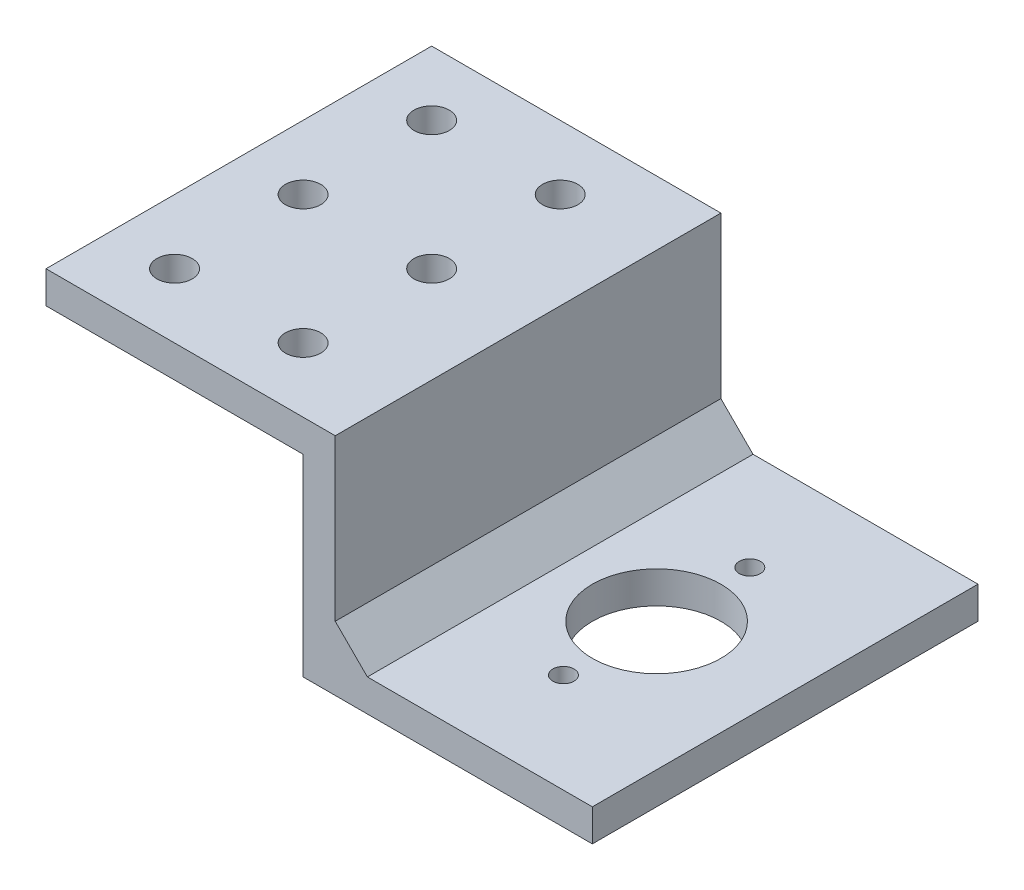
ISO-10303-21;
HEADER;
FILE_DESCRIPTION(('STEP AP214'),'2;1');
FILE_NAME('part.step','',(''),(''),'','','');
FILE_SCHEMA(('AUTOMOTIVE_DESIGN { 1 0 10303 214 1 1 1 1 }'));
ENDSEC;
DATA;
#1=APPLICATION_CONTEXT('core data for automotive mechanical design processes');
#2=APPLICATION_PROTOCOL_DEFINITION('international standard','automotive_design',2000,#1);
#3=PRODUCT_CONTEXT('',#1,'mechanical');
#4=PRODUCT('Part','Part','',(#3));
#5=PRODUCT_RELATED_PRODUCT_CATEGORY('part','',(#4));
#6=PRODUCT_DEFINITION_FORMATION('','',#4);
#7=PRODUCT_DEFINITION_CONTEXT('part definition',#1,'design');
#8=PRODUCT_DEFINITION('design','',#6,#7);
#9=PRODUCT_DEFINITION_SHAPE('','',#8);
#10=(LENGTH_UNIT() NAMED_UNIT(*) SI_UNIT(.MILLI.,.METRE.));
#11=(NAMED_UNIT(*) PLANE_ANGLE_UNIT() SI_UNIT($,.RADIAN.));
#12=(NAMED_UNIT(*) SI_UNIT($,.STERADIAN.) SOLID_ANGLE_UNIT());
#13=UNCERTAINTY_MEASURE_WITH_UNIT(LENGTH_MEASURE(1.E-05),#10,'distance_accuracy_value','');
#14=(GEOMETRIC_REPRESENTATION_CONTEXT(3) GLOBAL_UNCERTAINTY_ASSIGNED_CONTEXT((#13)) GLOBAL_UNIT_ASSIGNED_CONTEXT((#10,
#11,#12)) REPRESENTATION_CONTEXT('',''));
#15=CARTESIAN_POINT('',(0.,0.,0.));
#16=DIRECTION('',(0.,0.,1.));
#17=DIRECTION('',(1.,0.,0.));
#18=AXIS2_PLACEMENT_3D('',#15,#16,#17);
#19=CARTESIAN_POINT('',(0.,5.,60.));
#20=DIRECTION('',(-1.,0.,0.));
#21=DIRECTION('',(0.,-1.,0.));
#22=AXIS2_PLACEMENT_3D('',#19,#20,#21);
#23=PLANE('',#22);
#24=DIRECTION('',(0.,1.,0.));
#25=VECTOR('',#24,1.);
#26=CARTESIAN_POINT('',(0.,5.,0.));
#27=LINE('',#26,#25);
#28=CARTESIAN_POINT('',(0.,0.,0.));
#29=VERTEX_POINT('',#28);
#30=CARTESIAN_POINT('',(0.,5.,0.));
#31=VERTEX_POINT('',#30);
#32=EDGE_CURVE('E132',#29,#31,#27,.T.);
#33=ORIENTED_EDGE('',*,*,#32,.T.);
#34=DIRECTION('',(0.,0.,-1.));
#35=VECTOR('',#34,1.);
#36=CARTESIAN_POINT('',(0.,5.,60.));
#37=LINE('',#36,#35);
#38=CARTESIAN_POINT('',(0.,5.,60.));
#39=VERTEX_POINT('',#38);
#40=EDGE_CURVE('E113',#39,#31,#37,.T.);
#41=ORIENTED_EDGE('',*,*,#40,.F.);
#42=DIRECTION('',(0.,1.,0.));
#43=VECTOR('',#42,1.);
#44=CARTESIAN_POINT('',(0.,5.,60.));
#45=LINE('',#44,#43);
#46=CARTESIAN_POINT('',(0.,0.,60.));
#47=VERTEX_POINT('',#46);
#48=EDGE_CURVE('E119',#47,#39,#45,.T.);
#49=ORIENTED_EDGE('',*,*,#48,.F.);
#50=DIRECTION('',(0.,0.,-1.));
#51=VECTOR('',#50,1.);
#52=CARTESIAN_POINT('',(0.,0.,60.));
#53=LINE('',#52,#51);
#54=EDGE_CURVE('E163',#47,#29,#53,.T.);
#55=ORIENTED_EDGE('',*,*,#54,.T.);
#56=EDGE_LOOP('',(#33,#41,#49,#55));
#57=FACE_BOUND('',#56,.T.);
#58=ADVANCED_FACE('F40',(#57),#23,.F.);
#59=CARTESIAN_POINT('',(-40.,5.00000000000001,60.));
#60=DIRECTION('',(0.,-1.,0.));
#61=DIRECTION('',(1.,0.,0.));
#62=AXIS2_PLACEMENT_3D('',#59,#60,#61);
#63=PLANE('',#62);
#64=CARTESIAN_POINT('',(-20.,5.,44.5));
#65=DIRECTION('',(0.,1.,0.));
#66=DIRECTION('',(1.,0.,0.));
#67=AXIS2_PLACEMENT_3D('',#64,#65,#66);
#68=CIRCLE('',#67,1.65);
#69=CARTESIAN_POINT('',(-21.65,5.,44.5));
#70=VERTEX_POINT('',#69);
#71=EDGE_CURVE('E261',#70,#70,#68,.T.);
#72=ORIENTED_EDGE('',*,*,#71,.F.);
#73=EDGE_LOOP('',(#72));
#74=FACE_BOUND('',#73,.T.);
#75=CARTESIAN_POINT('',(-20.,5.,15.5));
#76=DIRECTION('',(0.,1.,0.));
#77=DIRECTION('',(-1.,0.,0.));
#78=AXIS2_PLACEMENT_3D('',#75,#76,#77);
#79=CIRCLE('',#78,1.65);
#80=CARTESIAN_POINT('',(-21.65,5.,15.5));
#81=VERTEX_POINT('',#80);
#82=EDGE_CURVE('E269',#81,#81,#79,.T.);
#83=ORIENTED_EDGE('',*,*,#82,.F.);
#84=EDGE_LOOP('',(#83));
#85=FACE_BOUND('',#84,.T.);
#86=CARTESIAN_POINT('',(-20.,5.,30.));
#87=DIRECTION('',(0.,1.,0.));
#88=DIRECTION('',(-1.,0.,0.));
#89=AXIS2_PLACEMENT_3D('',#86,#87,#88);
#90=CIRCLE('',#89,10.);
#91=CARTESIAN_POINT('',(-30.,5.,30.));
#92=VERTEX_POINT('',#91);
#93=EDGE_CURVE('E253',#92,#92,#90,.T.);
#94=ORIENTED_EDGE('',*,*,#93,.F.);
#95=EDGE_LOOP('',(#94));
#96=FACE_BOUND('',#95,.T.);
#97=DIRECTION('',(-1.,0.,0.));
#98=VECTOR('',#97,1.);
#99=CARTESIAN_POINT('',(-40.,5.00000000000001,0.));
#100=LINE('',#99,#98);
#101=CARTESIAN_POINT('',(-35.,5.00000000000001,0.));
#102=VERTEX_POINT('',#101);
#103=EDGE_CURVE('E183',#31,#102,#100,.T.);
#104=ORIENTED_EDGE('',*,*,#103,.T.);
#105=DIRECTION('',(0.,0.,1.));
#106=VECTOR('',#105,1.);
#107=CARTESIAN_POINT('',(-35.,5.00000000000001,60.));
#108=LINE('',#107,#106);
#109=CARTESIAN_POINT('',(-35.,5.00000000000001,60.));
#110=VERTEX_POINT('',#109);
#111=EDGE_CURVE('E57',#102,#110,#108,.T.);
#112=ORIENTED_EDGE('',*,*,#111,.T.);
#113=DIRECTION('',(-1.,0.,0.));
#114=VECTOR('',#113,1.);
#115=CARTESIAN_POINT('',(-40.,5.00000000000001,60.));
#116=LINE('',#115,#114);
#117=EDGE_CURVE('E109',#39,#110,#116,.T.);
#118=ORIENTED_EDGE('',*,*,#117,.F.);
#119=ORIENTED_EDGE('',*,*,#40,.T.);
#120=EDGE_LOOP('',(#104,#112,#118,#119));
#121=FACE_BOUND('',#120,.T.);
#122=ADVANCED_FACE('F111',(#74,#85,#96,#121),#63,.F.);
#123=CARTESIAN_POINT('',(-40.,35.,60.));
#124=DIRECTION('',(-1.,0.,0.));
#125=DIRECTION('',(0.,0.,1.));
#126=AXIS2_PLACEMENT_3D('',#123,#124,#125);
#127=PLANE('',#126);
#128=DIRECTION('',(0.,1.,0.));
#129=VECTOR('',#128,1.);
#130=CARTESIAN_POINT('',(-40.,35.,60.));
#131=LINE('',#130,#129);
#132=CARTESIAN_POINT('',(-40.,10.,60.));
#133=VERTEX_POINT('',#132);
#134=CARTESIAN_POINT('',(-40.,35.,60.));
#135=VERTEX_POINT('',#134);
#136=EDGE_CURVE('E118',#133,#135,#131,.T.);
#137=ORIENTED_EDGE('',*,*,#136,.F.);
#138=DIRECTION('',(0.,0.,-1.));
#139=VECTOR('',#138,1.);
#140=CARTESIAN_POINT('',(-40.,10.,0.));
#141=LINE('',#140,#139);
#142=CARTESIAN_POINT('',(-40.,10.,0.));
#143=VERTEX_POINT('',#142);
#144=EDGE_CURVE('E134',#133,#143,#141,.T.);
#145=ORIENTED_EDGE('',*,*,#144,.T.);
#146=DIRECTION('',(0.,1.,0.));
#147=VECTOR('',#146,1.);
#148=CARTESIAN_POINT('',(-40.,35.,0.));
#149=LINE('',#148,#147);
#150=CARTESIAN_POINT('',(-40.,35.,0.));
#151=VERTEX_POINT('',#150);
#152=EDGE_CURVE('E180',#143,#151,#149,.T.);
#153=ORIENTED_EDGE('',*,*,#152,.T.);
#154=DIRECTION('',(0.,0.,-1.));
#155=VECTOR('',#154,1.);
#156=CARTESIAN_POINT('',(-40.,35.,60.));
#157=LINE('',#156,#155);
#158=EDGE_CURVE('E135',#135,#151,#157,.T.);
#159=ORIENTED_EDGE('',*,*,#158,.F.);
#160=EDGE_LOOP('',(#137,#145,#153,#159));
#161=FACE_BOUND('',#160,.T.);
#162=ADVANCED_FACE('F290',(#161),#127,.F.);
#163=CARTESIAN_POINT('',(-85.,35.,60.));
#164=DIRECTION('',(0.,-1.,0.));
#165=DIRECTION('',(0.,0.,-1.));
#166=AXIS2_PLACEMENT_3D('',#163,#164,#165);
#167=PLANE('',#166);
#168=CARTESIAN_POINT('',(-55.,35.,9.99999999999999));
#169=DIRECTION('',(0.,-1.,0.));
#170=DIRECTION('',(-1.,0.,0.));
#171=AXIS2_PLACEMENT_3D('',#168,#169,#170);
#172=CIRCLE('',#171,2.75000000000001);
#173=CARTESIAN_POINT('',(-57.75,35.,9.99999999999999));
#174=VERTEX_POINT('',#173);
#175=EDGE_CURVE('E233',#174,#174,#172,.T.);
#176=ORIENTED_EDGE('',*,*,#175,.T.);
#177=EDGE_LOOP('',(#176));
#178=FACE_BOUND('',#177,.T.);
#179=CARTESIAN_POINT('',(-75.,35.,30.));
#180=DIRECTION('',(0.,-1.,0.));
#181=DIRECTION('',(1.,0.,0.));
#182=AXIS2_PLACEMENT_3D('',#179,#180,#181);
#183=CIRCLE('',#182,2.75000000000001);
#184=CARTESIAN_POINT('',(-72.25,35.,30.));
#185=VERTEX_POINT('',#184);
#186=EDGE_CURVE('E218',#185,#185,#183,.T.);
#187=ORIENTED_EDGE('',*,*,#186,.T.);
#188=EDGE_LOOP('',(#187));
#189=FACE_BOUND('',#188,.T.);
#190=CARTESIAN_POINT('',(-75.,35.,50.));
#191=DIRECTION('',(0.,-1.,0.));
#192=DIRECTION('',(1.,0.,0.));
#193=AXIS2_PLACEMENT_3D('',#190,#191,#192);
#194=CIRCLE('',#193,2.75000000000001);
#195=CARTESIAN_POINT('',(-72.25,35.,50.));
#196=VERTEX_POINT('',#195);
#197=EDGE_CURVE('E217',#196,#196,#194,.T.);
#198=ORIENTED_EDGE('',*,*,#197,.T.);
#199=EDGE_LOOP('',(#198));
#200=FACE_BOUND('',#199,.T.);
#201=CARTESIAN_POINT('',(-55.,35.,30.));
#202=DIRECTION('',(0.,-1.,0.));
#203=DIRECTION('',(1.,0.,0.));
#204=AXIS2_PLACEMENT_3D('',#201,#202,#203);
#205=CIRCLE('',#204,2.75000000000001);
#206=CARTESIAN_POINT('',(-52.25,35.,30.));
#207=VERTEX_POINT('',#206);
#208=EDGE_CURVE('E209',#207,#207,#205,.T.);
#209=ORIENTED_EDGE('',*,*,#208,.T.);
#210=EDGE_LOOP('',(#209));
#211=FACE_BOUND('',#210,.T.);
#212=CARTESIAN_POINT('',(-75.,35.,9.99999999999999));
#213=DIRECTION('',(0.,-1.,0.));
#214=DIRECTION('',(1.,0.,0.));
#215=AXIS2_PLACEMENT_3D('',#212,#213,#214);
#216=CIRCLE('',#215,2.75000000000001);
#217=CARTESIAN_POINT('',(-72.25,35.,9.99999999999999));
#218=VERTEX_POINT('',#217);
#219=EDGE_CURVE('E234',#218,#218,#216,.T.);
#220=ORIENTED_EDGE('',*,*,#219,.T.);
#221=EDGE_LOOP('',(#220));
#222=FACE_BOUND('',#221,.T.);
#223=CARTESIAN_POINT('',(-55.,35.,50.));
#224=DIRECTION('',(0.,-1.,0.));
#225=DIRECTION('',(1.,0.,0.));
#226=AXIS2_PLACEMENT_3D('',#223,#224,#225);
#227=CIRCLE('',#226,2.75000000000001);
#228=CARTESIAN_POINT('',(-52.25,35.,50.));
#229=VERTEX_POINT('',#228);
#230=EDGE_CURVE('E188',#229,#229,#227,.T.);
#231=ORIENTED_EDGE('',*,*,#230,.T.);
#232=EDGE_LOOP('',(#231));
#233=FACE_BOUND('',#232,.T.);
#234=DIRECTION('',(-1.,0.,0.));
#235=VECTOR('',#234,1.);
#236=CARTESIAN_POINT('',(-85.,35.,0.));
#237=LINE('',#236,#235);
#238=CARTESIAN_POINT('',(-85.,35.,0.));
#239=VERTEX_POINT('',#238);
#240=EDGE_CURVE('E177',#151,#239,#237,.T.);
#241=ORIENTED_EDGE('',*,*,#240,.T.);
#242=DIRECTION('',(0.,0.,-1.));
#243=VECTOR('',#242,1.);
#244=CARTESIAN_POINT('',(-85.,35.,60.));
#245=LINE('',#244,#243);
#246=CARTESIAN_POINT('',(-85.,35.,60.));
#247=VERTEX_POINT('',#246);
#248=EDGE_CURVE('E142',#247,#239,#245,.T.);
#249=ORIENTED_EDGE('',*,*,#248,.F.);
#250=DIRECTION('',(-1.,0.,0.));
#251=VECTOR('',#250,1.);
#252=CARTESIAN_POINT('',(-85.,35.,60.));
#253=LINE('',#252,#251);
#254=EDGE_CURVE('E200',#135,#247,#253,.T.);
#255=ORIENTED_EDGE('',*,*,#254,.F.);
#256=ORIENTED_EDGE('',*,*,#158,.T.);
#257=EDGE_LOOP('',(#241,#249,#255,#256));
#258=FACE_BOUND('',#257,.T.);
#259=ADVANCED_FACE('F315',(#178,#189,#200,#211,#222,#233,#258),#167,.F.);
#260=CARTESIAN_POINT('',(-85.,30.,60.));
#261=DIRECTION('',(1.,0.,0.));
#262=DIRECTION('',(0.,0.,-1.));
#263=AXIS2_PLACEMENT_3D('',#260,#261,#262);
#264=PLANE('',#263);
#265=DIRECTION('',(0.,-1.,0.));
#266=VECTOR('',#265,1.);
#267=CARTESIAN_POINT('',(-85.,30.,0.));
#268=LINE('',#267,#266);
#269=CARTESIAN_POINT('',(-85.,30.,0.));
#270=VERTEX_POINT('',#269);
#271=EDGE_CURVE('E174',#239,#270,#268,.T.);
#272=ORIENTED_EDGE('',*,*,#271,.T.);
#273=DIRECTION('',(0.,0.,-1.));
#274=VECTOR('',#273,1.);
#275=CARTESIAN_POINT('',(-85.,30.,60.));
#276=LINE('',#275,#274);
#277=CARTESIAN_POINT('',(-85.,30.,60.));
#278=VERTEX_POINT('',#277);
#279=EDGE_CURVE('E151',#278,#270,#276,.T.);
#280=ORIENTED_EDGE('',*,*,#279,.F.);
#281=DIRECTION('',(0.,-1.,0.));
#282=VECTOR('',#281,1.);
#283=CARTESIAN_POINT('',(-85.,30.,60.));
#284=LINE('',#283,#282);
#285=EDGE_CURVE('E197',#247,#278,#284,.T.);
#286=ORIENTED_EDGE('',*,*,#285,.F.);
#287=ORIENTED_EDGE('',*,*,#248,.T.);
#288=EDGE_LOOP('',(#272,#280,#286,#287));
#289=FACE_BOUND('',#288,.T.);
#290=ADVANCED_FACE('F319',(#289),#264,.F.);
#291=CARTESIAN_POINT('',(-45.,30.,60.));
#292=DIRECTION('',(0.,1.,0.));
#293=DIRECTION('',(-1.,0.,0.));
#294=AXIS2_PLACEMENT_3D('',#291,#292,#293);
#295=PLANE('',#294);
#296=CARTESIAN_POINT('',(-55.,30.,9.99999999999999));
#297=DIRECTION('',(0.,-1.,0.));
#298=DIRECTION('',(-1.,0.,0.));
#299=AXIS2_PLACEMENT_3D('',#296,#297,#298);
#300=CIRCLE('',#299,2.75000000000001);
#301=CARTESIAN_POINT('',(-57.75,30.,9.99999999999999));
#302=VERTEX_POINT('',#301);
#303=EDGE_CURVE('E229',#302,#302,#300,.T.);
#304=ORIENTED_EDGE('',*,*,#303,.F.);
#305=EDGE_LOOP('',(#304));
#306=FACE_BOUND('',#305,.T.);
#307=CARTESIAN_POINT('',(-75.,30.,30.));
#308=DIRECTION('',(0.,-1.,0.));
#309=DIRECTION('',(1.,0.,0.));
#310=AXIS2_PLACEMENT_3D('',#307,#308,#309);
#311=CIRCLE('',#310,2.75000000000001);
#312=CARTESIAN_POINT('',(-72.25,30.,30.));
#313=VERTEX_POINT('',#312);
#314=EDGE_CURVE('E238',#313,#313,#311,.T.);
#315=ORIENTED_EDGE('',*,*,#314,.F.);
#316=EDGE_LOOP('',(#315));
#317=FACE_BOUND('',#316,.T.);
#318=CARTESIAN_POINT('',(-75.,30.,50.));
#319=DIRECTION('',(0.,-1.,0.));
#320=DIRECTION('',(1.,0.,0.));
#321=AXIS2_PLACEMENT_3D('',#318,#319,#320);
#322=CIRCLE('',#321,2.75000000000001);
#323=CARTESIAN_POINT('',(-72.25,30.,50.));
#324=VERTEX_POINT('',#323);
#325=EDGE_CURVE('E213',#324,#324,#322,.T.);
#326=ORIENTED_EDGE('',*,*,#325,.F.);
#327=EDGE_LOOP('',(#326));
#328=FACE_BOUND('',#327,.T.);
#329=CARTESIAN_POINT('',(-55.,30.,30.));
#330=DIRECTION('',(0.,-1.,0.));
#331=DIRECTION('',(1.,0.,0.));
#332=AXIS2_PLACEMENT_3D('',#329,#330,#331);
#333=CIRCLE('',#332,2.75000000000001);
#334=CARTESIAN_POINT('',(-52.25,30.,30.));
#335=VERTEX_POINT('',#334);
#336=EDGE_CURVE('E222',#335,#335,#333,.T.);
#337=ORIENTED_EDGE('',*,*,#336,.F.);
#338=EDGE_LOOP('',(#337));
#339=FACE_BOUND('',#338,.T.);
#340=CARTESIAN_POINT('',(-75.,30.,9.99999999999999));
#341=DIRECTION('',(0.,-1.,0.));
#342=DIRECTION('',(1.,0.,0.));
#343=AXIS2_PLACEMENT_3D('',#340,#341,#342);
#344=CIRCLE('',#343,2.75000000000001);
#345=CARTESIAN_POINT('',(-72.25,30.,9.99999999999999));
#346=VERTEX_POINT('',#345);
#347=EDGE_CURVE('E245',#346,#346,#344,.T.);
#348=ORIENTED_EDGE('',*,*,#347,.F.);
#349=EDGE_LOOP('',(#348));
#350=FACE_BOUND('',#349,.T.);
#351=CARTESIAN_POINT('',(-55.,30.,50.));
#352=DIRECTION('',(0.,-1.,0.));
#353=DIRECTION('',(1.,0.,0.));
#354=AXIS2_PLACEMENT_3D('',#351,#352,#353);
#355=CIRCLE('',#354,2.75000000000001);
#356=CARTESIAN_POINT('',(-52.25,30.,50.));
#357=VERTEX_POINT('',#356);
#358=EDGE_CURVE('E205',#357,#357,#355,.T.);
#359=ORIENTED_EDGE('',*,*,#358,.F.);
#360=EDGE_LOOP('',(#359));
#361=FACE_BOUND('',#360,.T.);
#362=DIRECTION('',(1.,0.,0.));
#363=VECTOR('',#362,1.);
#364=CARTESIAN_POINT('',(-45.,30.,0.));
#365=LINE('',#364,#363);
#366=CARTESIAN_POINT('',(-45.,30.,0.));
#367=VERTEX_POINT('',#366);
#368=EDGE_CURVE('E171',#270,#367,#365,.T.);
#369=ORIENTED_EDGE('',*,*,#368,.T.);
#370=DIRECTION('',(0.,0.,-1.));
#371=VECTOR('',#370,1.);
#372=CARTESIAN_POINT('',(-45.,30.,60.));
#373=LINE('',#372,#371);
#374=CARTESIAN_POINT('',(-45.,30.,60.));
#375=VERTEX_POINT('',#374);
#376=EDGE_CURVE('E155',#375,#367,#373,.T.);
#377=ORIENTED_EDGE('',*,*,#376,.F.);
#378=DIRECTION('',(1.,0.,0.));
#379=VECTOR('',#378,1.);
#380=CARTESIAN_POINT('',(-45.,30.,60.));
#381=LINE('',#380,#379);
#382=EDGE_CURVE('E194',#278,#375,#381,.T.);
#383=ORIENTED_EDGE('',*,*,#382,.F.);
#384=ORIENTED_EDGE('',*,*,#279,.T.);
#385=EDGE_LOOP('',(#369,#377,#383,#384));
#386=FACE_BOUND('',#385,.T.);
#387=ADVANCED_FACE('F323',(#306,#317,#328,#339,#350,#361,#386),#295,.F.);
#388=CARTESIAN_POINT('',(-45.,0.,60.));
#389=DIRECTION('',(1.,0.,0.));
#390=DIRECTION('',(0.,1.,0.));
#391=AXIS2_PLACEMENT_3D('',#388,#389,#390);
#392=PLANE('',#391);
#393=DIRECTION('',(0.,-1.,0.));
#394=VECTOR('',#393,1.);
#395=CARTESIAN_POINT('',(-45.,0.,0.));
#396=LINE('',#395,#394);
#397=CARTESIAN_POINT('',(-45.,0.,0.));
#398=VERTEX_POINT('',#397);
#399=EDGE_CURVE('E168',#367,#398,#396,.T.);
#400=ORIENTED_EDGE('',*,*,#399,.T.);
#401=DIRECTION('',(0.,0.,-1.));
#402=VECTOR('',#401,1.);
#403=CARTESIAN_POINT('',(-45.,0.,60.));
#404=LINE('',#403,#402);
#405=CARTESIAN_POINT('',(-45.,0.,60.));
#406=VERTEX_POINT('',#405);
#407=EDGE_CURVE('E159',#406,#398,#404,.T.);
#408=ORIENTED_EDGE('',*,*,#407,.F.);
#409=DIRECTION('',(0.,-1.,0.));
#410=VECTOR('',#409,1.);
#411=CARTESIAN_POINT('',(-45.,0.,60.));
#412=LINE('',#411,#410);
#413=EDGE_CURVE('E191',#375,#406,#412,.T.);
#414=ORIENTED_EDGE('',*,*,#413,.F.);
#415=ORIENTED_EDGE('',*,*,#376,.T.);
#416=EDGE_LOOP('',(#400,#408,#414,#415));
#417=FACE_BOUND('',#416,.T.);
#418=ADVANCED_FACE('F327',(#417),#392,.F.);
#419=CARTESIAN_POINT('',(0.,0.,60.));
#420=DIRECTION('',(0.,1.,0.));
#421=DIRECTION('',(-1.,0.,0.));
#422=AXIS2_PLACEMENT_3D('',#419,#420,#421);
#423=PLANE('',#422);
#424=CARTESIAN_POINT('',(-20.,0.,44.5));
#425=DIRECTION('',(0.,1.,0.));
#426=DIRECTION('',(1.,0.,0.));
#427=AXIS2_PLACEMENT_3D('',#424,#425,#426);
#428=CIRCLE('',#427,1.65);
#429=CARTESIAN_POINT('',(-21.65,0.,44.5));
#430=VERTEX_POINT('',#429);
#431=EDGE_CURVE('E265',#430,#430,#428,.T.);
#432=ORIENTED_EDGE('',*,*,#431,.T.);
#433=EDGE_LOOP('',(#432));
#434=FACE_BOUND('',#433,.T.);
#435=CARTESIAN_POINT('',(-20.,0.,15.5));
#436=DIRECTION('',(0.,1.,0.));
#437=DIRECTION('',(-1.,0.,0.));
#438=AXIS2_PLACEMENT_3D('',#435,#436,#437);
#439=CIRCLE('',#438,1.65);
#440=CARTESIAN_POINT('',(-21.65,0.,15.5));
#441=VERTEX_POINT('',#440);
#442=EDGE_CURVE('E257',#441,#441,#439,.T.);
#443=ORIENTED_EDGE('',*,*,#442,.T.);
#444=EDGE_LOOP('',(#443));
#445=FACE_BOUND('',#444,.T.);
#446=CARTESIAN_POINT('',(-20.,0.,30.));
#447=DIRECTION('',(0.,1.,0.));
#448=DIRECTION('',(-1.,0.,0.));
#449=AXIS2_PLACEMENT_3D('',#446,#447,#448);
#450=CIRCLE('',#449,10.);
#451=CARTESIAN_POINT('',(-30.,0.,30.));
#452=VERTEX_POINT('',#451);
#453=EDGE_CURVE('E249',#452,#452,#450,.T.);
#454=ORIENTED_EDGE('',*,*,#453,.T.);
#455=EDGE_LOOP('',(#454));
#456=FACE_BOUND('',#455,.T.);
#457=DIRECTION('',(1.,0.,0.));
#458=VECTOR('',#457,1.);
#459=CARTESIAN_POINT('',(0.,0.,0.));
#460=LINE('',#459,#458);
#461=EDGE_CURVE('E129',#398,#29,#460,.T.);
#462=ORIENTED_EDGE('',*,*,#461,.T.);
#463=ORIENTED_EDGE('',*,*,#54,.F.);
#464=DIRECTION('',(1.,0.,0.));
#465=VECTOR('',#464,1.);
#466=CARTESIAN_POINT('',(0.,0.,60.));
#467=LINE('',#466,#465);
#468=EDGE_CURVE('E124',#406,#47,#467,.T.);
#469=ORIENTED_EDGE('',*,*,#468,.F.);
#470=ORIENTED_EDGE('',*,*,#407,.T.);
#471=EDGE_LOOP('',(#462,#463,#469,#470));
#472=FACE_BOUND('',#471,.T.);
#473=ADVANCED_FACE('F277',(#434,#445,#456,#472),#423,.F.);
#474=CARTESIAN_POINT('',(0.,0.,60.));
#475=DIRECTION('',(0.,0.,-1.));
#476=DIRECTION('',(-1.,0.,0.));
#477=AXIS2_PLACEMENT_3D('',#474,#475,#476);
#478=PLANE('',#477);
#479=ORIENTED_EDGE('',*,*,#48,.T.);
#480=ORIENTED_EDGE('',*,*,#117,.T.);
#481=DIRECTION('',(0.707106781186544,-0.707106781186551,0.));
#482=VECTOR('',#481,1.);
#483=CARTESIAN_POINT('',(-15.0000000000002,-15.,60.));
#484=LINE('',#483,#482);
#485=EDGE_CURVE('E11',#110,#133,#484,.F.);
#486=ORIENTED_EDGE('',*,*,#485,.T.);
#487=ORIENTED_EDGE('',*,*,#136,.T.);
#488=ORIENTED_EDGE('',*,*,#254,.T.);
#489=ORIENTED_EDGE('',*,*,#285,.T.);
#490=ORIENTED_EDGE('',*,*,#382,.T.);
#491=ORIENTED_EDGE('',*,*,#413,.T.);
#492=ORIENTED_EDGE('',*,*,#468,.T.);
#493=EDGE_LOOP('',(#479,#480,#486,#487,#488,#489,#490,#491,#492));
#494=FACE_BOUND('',#493,.T.);
#495=ADVANCED_FACE('F122',(#494),#478,.F.);
#496=CARTESIAN_POINT('',(0.,0.,0.));
#497=DIRECTION('',(0.,0.,-1.));
#498=DIRECTION('',(-1.,0.,0.));
#499=AXIS2_PLACEMENT_3D('',#496,#497,#498);
#500=PLANE('',#499);
#501=ORIENTED_EDGE('',*,*,#32,.F.);
#502=ORIENTED_EDGE('',*,*,#461,.F.);
#503=ORIENTED_EDGE('',*,*,#399,.F.);
#504=ORIENTED_EDGE('',*,*,#368,.F.);
#505=ORIENTED_EDGE('',*,*,#271,.F.);
#506=ORIENTED_EDGE('',*,*,#240,.F.);
#507=ORIENTED_EDGE('',*,*,#152,.F.);
#508=DIRECTION('',(-0.707106781186544,0.707106781186551,0.));
#509=VECTOR('',#508,1.);
#510=CARTESIAN_POINT('',(-40.,10.,0.));
#511=LINE('',#510,#509);
#512=EDGE_CURVE('E50',#143,#102,#511,.F.);
#513=ORIENTED_EDGE('',*,*,#512,.T.);
#514=ORIENTED_EDGE('',*,*,#103,.F.);
#515=EDGE_LOOP('',(#501,#502,#503,#504,#505,#506,#507,#513,#514));
#516=FACE_BOUND('',#515,.T.);
#517=ADVANCED_FACE('F335',(#516),#500,.T.);
#518=CARTESIAN_POINT('',(-55.,35.,50.));
#519=DIRECTION('',(0.,-1.,0.));
#520=DIRECTION('',(1.,0.,0.));
#521=AXIS2_PLACEMENT_3D('',#518,#519,#520);
#522=CYLINDRICAL_SURFACE('',#521,2.75000000000001);
#523=ORIENTED_EDGE('',*,*,#230,.F.);
#524=EDGE_LOOP('',(#523));
#525=FACE_BOUND('',#524,.T.);
#526=ORIENTED_EDGE('',*,*,#358,.T.);
#527=EDGE_LOOP('',(#526));
#528=FACE_BOUND('',#527,.T.);
#529=ADVANCED_FACE('F338',(#525,#528),#522,.F.);
#530=CARTESIAN_POINT('',(-75.,35.,9.99999999999999));
#531=DIRECTION('',(0.,-1.,0.));
#532=DIRECTION('',(1.,0.,0.));
#533=AXIS2_PLACEMENT_3D('',#530,#531,#532);
#534=CYLINDRICAL_SURFACE('',#533,2.75000000000001);
#535=ORIENTED_EDGE('',*,*,#219,.F.);
#536=EDGE_LOOP('',(#535));
#537=FACE_BOUND('',#536,.T.);
#538=ORIENTED_EDGE('',*,*,#347,.T.);
#539=EDGE_LOOP('',(#538));
#540=FACE_BOUND('',#539,.T.);
#541=ADVANCED_FACE('F343',(#537,#540),#534,.F.);
#542=CARTESIAN_POINT('',(-55.,35.,30.));
#543=DIRECTION('',(0.,-1.,0.));
#544=DIRECTION('',(1.,0.,0.));
#545=AXIS2_PLACEMENT_3D('',#542,#543,#544);
#546=CYLINDRICAL_SURFACE('',#545,2.75000000000001);
#547=ORIENTED_EDGE('',*,*,#208,.F.);
#548=EDGE_LOOP('',(#547));
#549=FACE_BOUND('',#548,.T.);
#550=ORIENTED_EDGE('',*,*,#336,.T.);
#551=EDGE_LOOP('',(#550));
#552=FACE_BOUND('',#551,.T.);
#553=ADVANCED_FACE('F348',(#549,#552),#546,.F.);
#554=CARTESIAN_POINT('',(-75.,35.,50.));
#555=DIRECTION('',(0.,-1.,0.));
#556=DIRECTION('',(1.,0.,0.));
#557=AXIS2_PLACEMENT_3D('',#554,#555,#556);
#558=CYLINDRICAL_SURFACE('',#557,2.75000000000001);
#559=ORIENTED_EDGE('',*,*,#197,.F.);
#560=EDGE_LOOP('',(#559));
#561=FACE_BOUND('',#560,.T.);
#562=ORIENTED_EDGE('',*,*,#325,.T.);
#563=EDGE_LOOP('',(#562));
#564=FACE_BOUND('',#563,.T.);
#565=ADVANCED_FACE('F345',(#561,#564),#558,.F.);
#566=CARTESIAN_POINT('',(-75.,35.,30.));
#567=DIRECTION('',(0.,-1.,0.));
#568=DIRECTION('',(1.,0.,0.));
#569=AXIS2_PLACEMENT_3D('',#566,#567,#568);
#570=CYLINDRICAL_SURFACE('',#569,2.75000000000001);
#571=ORIENTED_EDGE('',*,*,#186,.F.);
#572=EDGE_LOOP('',(#571));
#573=FACE_BOUND('',#572,.T.);
#574=ORIENTED_EDGE('',*,*,#314,.T.);
#575=EDGE_LOOP('',(#574));
#576=FACE_BOUND('',#575,.T.);
#577=ADVANCED_FACE('F302',(#573,#576),#570,.F.);
#578=CARTESIAN_POINT('',(-55.,35.,9.99999999999999));
#579=DIRECTION('',(0.,-1.,0.));
#580=DIRECTION('',(1.,0.,0.));
#581=AXIS2_PLACEMENT_3D('',#578,#579,#580);
#582=CYLINDRICAL_SURFACE('',#581,2.75000000000001);
#583=ORIENTED_EDGE('',*,*,#175,.F.);
#584=EDGE_LOOP('',(#583));
#585=FACE_BOUND('',#584,.T.);
#586=ORIENTED_EDGE('',*,*,#303,.T.);
#587=EDGE_LOOP('',(#586));
#588=FACE_BOUND('',#587,.T.);
#589=ADVANCED_FACE('F296',(#585,#588),#582,.F.);
#590=CARTESIAN_POINT('',(-20.,0.,30.));
#591=DIRECTION('',(0.,1.,0.));
#592=DIRECTION('',(-1.,0.,0.));
#593=AXIS2_PLACEMENT_3D('',#590,#591,#592);
#594=CYLINDRICAL_SURFACE('',#593,10.);
#595=CARTESIAN_POINT('',(-30.,0.,30.));
#596=CARTESIAN_POINT('',(-30.,0.0520833333333252,30.));
#597=CARTESIAN_POINT('',(-30.,0.104166666666659,30.));
#598=CARTESIAN_POINT('',(-30.,0.208333333333326,30.));
#599=CARTESIAN_POINT('',(-30.,0.260416666666659,30.));
#600=CARTESIAN_POINT('',(-30.,0.364583333333326,30.));
#601=CARTESIAN_POINT('',(-30.,0.416666666666659,30.));
#602=CARTESIAN_POINT('',(-30.,0.520833333333326,30.));
#603=CARTESIAN_POINT('',(-30.,0.57291666666666,30.));
#604=CARTESIAN_POINT('',(-30.,0.677083333333326,30.));
#605=CARTESIAN_POINT('',(-30.,0.72916666666666,30.));
#606=CARTESIAN_POINT('',(-30.,0.833333333333327,30.));
#607=CARTESIAN_POINT('',(-30.,0.88541666666666,30.));
#608=CARTESIAN_POINT('',(-30.,0.989583333333327,30.));
#609=CARTESIAN_POINT('',(-30.,1.04166666666666,30.));
#610=CARTESIAN_POINT('',(-30.,1.14583333333333,30.));
#611=CARTESIAN_POINT('',(-30.,1.19791666666666,30.));
#612=CARTESIAN_POINT('',(-30.,1.30208333333333,30.));
#613=CARTESIAN_POINT('',(-30.,1.35416666666666,30.));
#614=CARTESIAN_POINT('',(-30.,1.45833333333333,30.));
#615=CARTESIAN_POINT('',(-30.,1.51041666666666,30.));
#616=CARTESIAN_POINT('',(-30.,1.61458333333333,30.));
#617=CARTESIAN_POINT('',(-30.,1.66666666666666,30.));
#618=CARTESIAN_POINT('',(-30.,1.77083333333333,30.));
#619=CARTESIAN_POINT('',(-30.,1.82291666666666,30.));
#620=CARTESIAN_POINT('',(-30.,1.92708333333333,30.));
#621=CARTESIAN_POINT('',(-30.,1.97916666666666,30.));
#622=CARTESIAN_POINT('',(-30.,2.08333333333333,30.));
#623=CARTESIAN_POINT('',(-30.,2.13541666666666,30.));
#624=CARTESIAN_POINT('',(-30.,2.23958333333333,30.));
#625=CARTESIAN_POINT('',(-30.,2.29166666666666,30.));
#626=CARTESIAN_POINT('',(-30.,2.39583333333333,30.));
#627=CARTESIAN_POINT('',(-30.,2.44791666666666,30.));
#628=CARTESIAN_POINT('',(-30.,2.55208333333333,30.));
#629=CARTESIAN_POINT('',(-30.,2.60416666666666,30.));
#630=CARTESIAN_POINT('',(-30.,2.70833333333333,30.));
#631=CARTESIAN_POINT('',(-30.,2.76041666666666,30.));
#632=CARTESIAN_POINT('',(-30.,2.86458333333333,30.));
#633=CARTESIAN_POINT('',(-30.,2.91666666666666,30.));
#634=CARTESIAN_POINT('',(-30.,3.02083333333333,30.));
#635=CARTESIAN_POINT('',(-30.,3.07291666666666,30.));
#636=CARTESIAN_POINT('',(-30.,3.17708333333333,30.));
#637=CARTESIAN_POINT('',(-30.,3.22916666666666,30.));
#638=CARTESIAN_POINT('',(-30.,3.33333333333333,30.));
#639=CARTESIAN_POINT('',(-30.,3.38541666666666,30.));
#640=CARTESIAN_POINT('',(-30.,3.48958333333333,30.));
#641=CARTESIAN_POINT('',(-30.,3.54166666666666,30.));
#642=CARTESIAN_POINT('',(-30.,3.64583333333333,30.));
#643=CARTESIAN_POINT('',(-30.,3.69791666666667,30.));
#644=CARTESIAN_POINT('',(-30.,3.80208333333333,30.));
#645=CARTESIAN_POINT('',(-30.,3.85416666666667,30.));
#646=CARTESIAN_POINT('',(-30.,3.95833333333333,30.));
#647=CARTESIAN_POINT('',(-30.,4.01041666666667,30.));
#648=CARTESIAN_POINT('',(-30.,4.11458333333333,30.));
#649=CARTESIAN_POINT('',(-30.,4.16666666666667,30.));
#650=CARTESIAN_POINT('',(-30.,4.27083333333333,30.));
#651=CARTESIAN_POINT('',(-30.,4.32291666666667,30.));
#652=CARTESIAN_POINT('',(-30.,4.42708333333333,30.));
#653=CARTESIAN_POINT('',(-30.,4.47916666666667,30.));
#654=CARTESIAN_POINT('',(-30.,4.58333333333333,30.));
#655=CARTESIAN_POINT('',(-30.,4.63541666666667,30.));
#656=CARTESIAN_POINT('',(-30.,4.73958333333333,30.));
#657=CARTESIAN_POINT('',(-30.,4.79166666666667,30.));
#658=CARTESIAN_POINT('',(-30.,4.89583333333333,30.));
#659=CARTESIAN_POINT('',(-30.,4.94791666666667,30.));
#660=CARTESIAN_POINT('',(-30.,5.,30.));
#661=B_SPLINE_CURVE_WITH_KNOTS('',3,(#595,#596,#597,#598,#599,#600,#601,#602,#603,#604,#605,
#606,#607,#608,#609,#610,#611,#612,#613,#614,#615,#616,#617,#618,#619,#620,#621,#622,#623,#624,
#625,#626,#627,#628,#629,#630,#631,#632,#633,#634,#635,#636,#637,#638,#639,#640,#641,#642,#643,
#644,#645,#646,#647,#648,#649,#650,#651,#652,#653,#654,#655,#656,#657,#658,#659,#660),
.UNSPECIFIED.,.F.,.F.,(4,2,2,2,2,2,2,2,2,2,2,2,2,2,2,2,2,2,2,2,2,2,2,2,2,2,2,2,2,2,2,2,4),(0.,
0.15625,0.312500000000001,0.468750000000001,0.625000000000001,0.781250000000002,
0.937500000000002,1.09375,1.25,1.40625,1.5625,1.71875,1.875,2.03125,2.1875,2.34375,2.5,2.65625,
2.8125,2.96875000000001,3.12500000000001,3.28125000000001,3.43750000000001,3.59375000000001,
3.75000000000001,3.90625000000001,4.06250000000001,4.21875000000001,4.37500000000001,
4.53125000000001,4.68750000000001,4.84375000000001,5.00000000000001),.UNSPECIFIED.);
#662=EDGE_CURVE('BSEAM284',#452,#92,#661,.T.);
#663=ORIENTED_EDGE('',*,*,#453,.F.);
#664=ORIENTED_EDGE('',*,*,#93,.T.);
#665=ORIENTED_EDGE('',*,*,#662,.T.);
#666=ORIENTED_EDGE('',*,*,#662,.F.);
#667=EDGE_LOOP('',(#663,#665,#664,#666));
#668=FACE_BOUND('',#667,.T.);
#669=ADVANCED_FACE('F284',(#668),#594,.F.);
#670=CARTESIAN_POINT('',(-20.,0.,15.5));
#671=DIRECTION('',(0.,1.,0.));
#672=DIRECTION('',(-1.,0.,0.));
#673=AXIS2_PLACEMENT_3D('',#670,#671,#672);
#674=CYLINDRICAL_SURFACE('',#673,1.65);
#675=CARTESIAN_POINT('',(-21.65,0.,15.5));
#676=CARTESIAN_POINT('',(-21.65,0.0520833333333248,15.5));
#677=CARTESIAN_POINT('',(-21.65,0.104166666666658,15.5));
#678=CARTESIAN_POINT('',(-21.65,0.208333333333325,15.5));
#679=CARTESIAN_POINT('',(-21.65,0.260416666666659,15.5));
#680=CARTESIAN_POINT('',(-21.65,0.364583333333326,15.5));
#681=CARTESIAN_POINT('',(-21.65,0.416666666666659,15.5));
#682=CARTESIAN_POINT('',(-21.65,0.520833333333326,15.5));
#683=CARTESIAN_POINT('',(-21.65,0.572916666666659,15.5));
#684=CARTESIAN_POINT('',(-21.65,0.677083333333326,15.5));
#685=CARTESIAN_POINT('',(-21.65,0.72916666666666,15.5));
#686=CARTESIAN_POINT('',(-21.65,0.833333333333327,15.5));
#687=CARTESIAN_POINT('',(-21.65,0.88541666666666,15.5));
#688=CARTESIAN_POINT('',(-21.65,0.989583333333327,15.5));
#689=CARTESIAN_POINT('',(-21.65,1.04166666666666,15.5));
#690=CARTESIAN_POINT('',(-21.65,1.14583333333333,15.5));
#691=CARTESIAN_POINT('',(-21.65,1.19791666666666,15.5));
#692=CARTESIAN_POINT('',(-21.65,1.30208333333333,15.5));
#693=CARTESIAN_POINT('',(-21.65,1.35416666666666,15.5));
#694=CARTESIAN_POINT('',(-21.65,1.45833333333333,15.5));
#695=CARTESIAN_POINT('',(-21.65,1.51041666666666,15.5));
#696=CARTESIAN_POINT('',(-21.65,1.61458333333333,15.5));
#697=CARTESIAN_POINT('',(-21.65,1.66666666666666,15.5));
#698=CARTESIAN_POINT('',(-21.65,1.77083333333333,15.5));
#699=CARTESIAN_POINT('',(-21.65,1.82291666666666,15.5));
#700=CARTESIAN_POINT('',(-21.65,1.92708333333333,15.5));
#701=CARTESIAN_POINT('',(-21.65,1.97916666666666,15.5));
#702=CARTESIAN_POINT('',(-21.65,2.08333333333333,15.5));
#703=CARTESIAN_POINT('',(-21.65,2.13541666666666,15.5));
#704=CARTESIAN_POINT('',(-21.65,2.23958333333333,15.5));
#705=CARTESIAN_POINT('',(-21.65,2.29166666666666,15.5));
#706=CARTESIAN_POINT('',(-21.65,2.39583333333333,15.5));
#707=CARTESIAN_POINT('',(-21.65,2.44791666666666,15.5));
#708=CARTESIAN_POINT('',(-21.65,2.55208333333333,15.5));
#709=CARTESIAN_POINT('',(-21.65,2.60416666666666,15.5));
#710=CARTESIAN_POINT('',(-21.65,2.70833333333333,15.5));
#711=CARTESIAN_POINT('',(-21.65,2.76041666666666,15.5));
#712=CARTESIAN_POINT('',(-21.65,2.86458333333333,15.5));
#713=CARTESIAN_POINT('',(-21.65,2.91666666666666,15.5));
#714=CARTESIAN_POINT('',(-21.65,3.02083333333333,15.5));
#715=CARTESIAN_POINT('',(-21.65,3.07291666666666,15.5));
#716=CARTESIAN_POINT('',(-21.65,3.17708333333333,15.5));
#717=CARTESIAN_POINT('',(-21.65,3.22916666666666,15.5));
#718=CARTESIAN_POINT('',(-21.65,3.33333333333333,15.5));
#719=CARTESIAN_POINT('',(-21.65,3.38541666666667,15.5));
#720=CARTESIAN_POINT('',(-21.65,3.48958333333333,15.5));
#721=CARTESIAN_POINT('',(-21.65,3.54166666666667,15.5));
#722=CARTESIAN_POINT('',(-21.65,3.64583333333333,15.5));
#723=CARTESIAN_POINT('',(-21.65,3.69791666666667,15.5));
#724=CARTESIAN_POINT('',(-21.65,3.80208333333333,15.5));
#725=CARTESIAN_POINT('',(-21.65,3.85416666666667,15.5));
#726=CARTESIAN_POINT('',(-21.65,3.95833333333333,15.5));
#727=CARTESIAN_POINT('',(-21.65,4.01041666666667,15.5));
#728=CARTESIAN_POINT('',(-21.65,4.11458333333333,15.5));
#729=CARTESIAN_POINT('',(-21.65,4.16666666666667,15.5));
#730=CARTESIAN_POINT('',(-21.65,4.27083333333333,15.5));
#731=CARTESIAN_POINT('',(-21.65,4.32291666666667,15.5));
#732=CARTESIAN_POINT('',(-21.65,4.42708333333333,15.5));
#733=CARTESIAN_POINT('',(-21.65,4.47916666666667,15.5));
#734=CARTESIAN_POINT('',(-21.65,4.58333333333333,15.5));
#735=CARTESIAN_POINT('',(-21.65,4.63541666666667,15.5));
#736=CARTESIAN_POINT('',(-21.65,4.73958333333333,15.5));
#737=CARTESIAN_POINT('',(-21.65,4.79166666666667,15.5));
#738=CARTESIAN_POINT('',(-21.65,4.89583333333334,15.5));
#739=CARTESIAN_POINT('',(-21.65,4.94791666666667,15.5));
#740=CARTESIAN_POINT('',(-21.65,5.,15.5));
#741=B_SPLINE_CURVE_WITH_KNOTS('',3,(#675,#676,#677,#678,#679,#680,#681,#682,#683,#684,#685,
#686,#687,#688,#689,#690,#691,#692,#693,#694,#695,#696,#697,#698,#699,#700,#701,#702,#703,#704,
#705,#706,#707,#708,#709,#710,#711,#712,#713,#714,#715,#716,#717,#718,#719,#720,#721,#722,#723,
#724,#725,#726,#727,#728,#729,#730,#731,#732,#733,#734,#735,#736,#737,#738,#739,#740),
.UNSPECIFIED.,.F.,.F.,(4,2,2,2,2,2,2,2,2,2,2,2,2,2,2,2,2,2,2,2,2,2,2,2,2,2,2,2,2,2,2,2,4),(0.,
0.15625,0.312500000000001,0.468750000000001,0.625000000000001,0.781250000000002,
0.937500000000002,1.09375,1.25,1.40625,1.5625,1.71875,1.875,2.03125,2.1875,2.34375000000001,
2.50000000000001,2.65625000000001,2.81250000000001,2.96875000000001,3.12500000000001,
3.28125000000001,3.43750000000001,3.59375000000001,3.75000000000001,3.90625000000001,
4.06250000000001,4.21875000000001,4.37500000000001,4.53125000000001,4.68750000000001,
4.84375000000001,5.00000000000001),.UNSPECIFIED.);
#742=EDGE_CURVE('BSEAM280',#441,#81,#741,.T.);
#743=ORIENTED_EDGE('',*,*,#442,.F.);
#744=ORIENTED_EDGE('',*,*,#82,.T.);
#745=ORIENTED_EDGE('',*,*,#742,.T.);
#746=ORIENTED_EDGE('',*,*,#742,.F.);
#747=EDGE_LOOP('',(#743,#745,#744,#746));
#748=FACE_BOUND('',#747,.T.);
#749=ADVANCED_FACE('F280',(#748),#674,.F.);
#750=CARTESIAN_POINT('',(-20.,0.,44.5));
#751=DIRECTION('',(0.,1.,0.));
#752=DIRECTION('',(-1.,0.,0.));
#753=AXIS2_PLACEMENT_3D('',#750,#751,#752);
#754=CYLINDRICAL_SURFACE('',#753,1.65);
#755=CARTESIAN_POINT('',(-21.65,0.,44.5));
#756=CARTESIAN_POINT('',(-21.65,0.0520833333333248,44.5));
#757=CARTESIAN_POINT('',(-21.65,0.104166666666658,44.5));
#758=CARTESIAN_POINT('',(-21.65,0.208333333333325,44.5));
#759=CARTESIAN_POINT('',(-21.65,0.260416666666659,44.5));
#760=CARTESIAN_POINT('',(-21.65,0.364583333333326,44.5));
#761=CARTESIAN_POINT('',(-21.65,0.416666666666659,44.5));
#762=CARTESIAN_POINT('',(-21.65,0.520833333333326,44.5));
#763=CARTESIAN_POINT('',(-21.65,0.572916666666659,44.5));
#764=CARTESIAN_POINT('',(-21.65,0.677083333333326,44.5));
#765=CARTESIAN_POINT('',(-21.65,0.72916666666666,44.5));
#766=CARTESIAN_POINT('',(-21.65,0.833333333333327,44.5));
#767=CARTESIAN_POINT('',(-21.65,0.88541666666666,44.5));
#768=CARTESIAN_POINT('',(-21.65,0.989583333333327,44.5));
#769=CARTESIAN_POINT('',(-21.65,1.04166666666666,44.5));
#770=CARTESIAN_POINT('',(-21.65,1.14583333333333,44.5));
#771=CARTESIAN_POINT('',(-21.65,1.19791666666666,44.5));
#772=CARTESIAN_POINT('',(-21.65,1.30208333333333,44.5));
#773=CARTESIAN_POINT('',(-21.65,1.35416666666666,44.5));
#774=CARTESIAN_POINT('',(-21.65,1.45833333333333,44.5));
#775=CARTESIAN_POINT('',(-21.65,1.51041666666666,44.5));
#776=CARTESIAN_POINT('',(-21.65,1.61458333333333,44.5));
#777=CARTESIAN_POINT('',(-21.65,1.66666666666666,44.5));
#778=CARTESIAN_POINT('',(-21.65,1.77083333333333,44.5));
#779=CARTESIAN_POINT('',(-21.65,1.82291666666666,44.5));
#780=CARTESIAN_POINT('',(-21.65,1.92708333333333,44.5));
#781=CARTESIAN_POINT('',(-21.65,1.97916666666666,44.5));
#782=CARTESIAN_POINT('',(-21.65,2.08333333333333,44.5));
#783=CARTESIAN_POINT('',(-21.65,2.13541666666666,44.5));
#784=CARTESIAN_POINT('',(-21.65,2.23958333333333,44.5));
#785=CARTESIAN_POINT('',(-21.65,2.29166666666666,44.5));
#786=CARTESIAN_POINT('',(-21.65,2.39583333333333,44.5));
#787=CARTESIAN_POINT('',(-21.65,2.44791666666666,44.5));
#788=CARTESIAN_POINT('',(-21.65,2.55208333333333,44.5));
#789=CARTESIAN_POINT('',(-21.65,2.60416666666666,44.5));
#790=CARTESIAN_POINT('',(-21.65,2.70833333333333,44.5));
#791=CARTESIAN_POINT('',(-21.65,2.76041666666666,44.5));
#792=CARTESIAN_POINT('',(-21.65,2.86458333333333,44.5));
#793=CARTESIAN_POINT('',(-21.65,2.91666666666666,44.5));
#794=CARTESIAN_POINT('',(-21.65,3.02083333333333,44.5));
#795=CARTESIAN_POINT('',(-21.65,3.07291666666666,44.5));
#796=CARTESIAN_POINT('',(-21.65,3.17708333333333,44.5));
#797=CARTESIAN_POINT('',(-21.65,3.22916666666666,44.5));
#798=CARTESIAN_POINT('',(-21.65,3.33333333333333,44.5));
#799=CARTESIAN_POINT('',(-21.65,3.38541666666667,44.5));
#800=CARTESIAN_POINT('',(-21.65,3.48958333333333,44.5));
#801=CARTESIAN_POINT('',(-21.65,3.54166666666667,44.5));
#802=CARTESIAN_POINT('',(-21.65,3.64583333333333,44.5));
#803=CARTESIAN_POINT('',(-21.65,3.69791666666667,44.5));
#804=CARTESIAN_POINT('',(-21.65,3.80208333333333,44.5));
#805=CARTESIAN_POINT('',(-21.65,3.85416666666667,44.5));
#806=CARTESIAN_POINT('',(-21.65,3.95833333333333,44.5));
#807=CARTESIAN_POINT('',(-21.65,4.01041666666667,44.5));
#808=CARTESIAN_POINT('',(-21.65,4.11458333333333,44.5));
#809=CARTESIAN_POINT('',(-21.65,4.16666666666667,44.5));
#810=CARTESIAN_POINT('',(-21.65,4.27083333333333,44.5));
#811=CARTESIAN_POINT('',(-21.65,4.32291666666667,44.5));
#812=CARTESIAN_POINT('',(-21.65,4.42708333333333,44.5));
#813=CARTESIAN_POINT('',(-21.65,4.47916666666667,44.5));
#814=CARTESIAN_POINT('',(-21.65,4.58333333333333,44.5));
#815=CARTESIAN_POINT('',(-21.65,4.63541666666667,44.5));
#816=CARTESIAN_POINT('',(-21.65,4.73958333333333,44.5));
#817=CARTESIAN_POINT('',(-21.65,4.79166666666667,44.5));
#818=CARTESIAN_POINT('',(-21.65,4.89583333333334,44.5));
#819=CARTESIAN_POINT('',(-21.65,4.94791666666667,44.5));
#820=CARTESIAN_POINT('',(-21.65,5.,44.5));
#821=B_SPLINE_CURVE_WITH_KNOTS('',3,(#755,#756,#757,#758,#759,#760,#761,#762,#763,#764,#765,
#766,#767,#768,#769,#770,#771,#772,#773,#774,#775,#776,#777,#778,#779,#780,#781,#782,#783,#784,
#785,#786,#787,#788,#789,#790,#791,#792,#793,#794,#795,#796,#797,#798,#799,#800,#801,#802,#803,
#804,#805,#806,#807,#808,#809,#810,#811,#812,#813,#814,#815,#816,#817,#818,#819,#820),
.UNSPECIFIED.,.F.,.F.,(4,2,2,2,2,2,2,2,2,2,2,2,2,2,2,2,2,2,2,2,2,2,2,2,2,2,2,2,2,2,2,2,4),(0.,
0.15625,0.312500000000001,0.468750000000001,0.625000000000001,0.781250000000002,
0.937500000000002,1.09375,1.25,1.40625,1.5625,1.71875,1.875,2.03125,2.1875,2.34375000000001,
2.50000000000001,2.65625000000001,2.81250000000001,2.96875000000001,3.12500000000001,
3.28125000000001,3.43750000000001,3.59375000000001,3.75000000000001,3.90625000000001,
4.06250000000001,4.21875000000001,4.37500000000001,4.53125000000001,4.68750000000001,
4.84375000000001,5.00000000000001),.UNSPECIFIED.);
#822=EDGE_CURVE('BSEAM283',#430,#70,#821,.T.);
#823=ORIENTED_EDGE('',*,*,#431,.F.);
#824=ORIENTED_EDGE('',*,*,#71,.T.);
#825=ORIENTED_EDGE('',*,*,#822,.T.);
#826=ORIENTED_EDGE('',*,*,#822,.F.);
#827=EDGE_LOOP('',(#823,#825,#824,#826));
#828=FACE_BOUND('',#827,.T.);
#829=ADVANCED_FACE('F283',(#828),#754,.F.);
#830=CARTESIAN_POINT('',(-40.,10.,60.));
#831=DIRECTION('',(0.707106781186551,0.707106781186544,0.));
#832=DIRECTION('',(0.,0.,1.));
#833=AXIS2_PLACEMENT_3D('',#830,#831,#832);
#834=PLANE('',#833);
#835=ORIENTED_EDGE('',*,*,#485,.F.);
#836=ORIENTED_EDGE('',*,*,#111,.F.);
#837=ORIENTED_EDGE('',*,*,#512,.F.);
#838=ORIENTED_EDGE('',*,*,#144,.F.);
#839=EDGE_LOOP('',(#835,#836,#837,#838));
#840=FACE_BOUND('',#839,.T.);
#841=ADVANCED_FACE('F43',(#840),#834,.T.);
#842=CLOSED_SHELL('',(#58,#122,#162,#259,#290,#387,#418,#473,#495,#517,#529,#541,#553,#565,#577,
#589,#669,#749,#829,#841));
#843=MANIFOLD_SOLID_BREP('B2',#842);
#844=ADVANCED_BREP_SHAPE_REPRESENTATION('',(#18,#843),#14);
#845=SHAPE_DEFINITION_REPRESENTATION(#9,#844);
ENDSEC;
END-ISO-10303-21;
